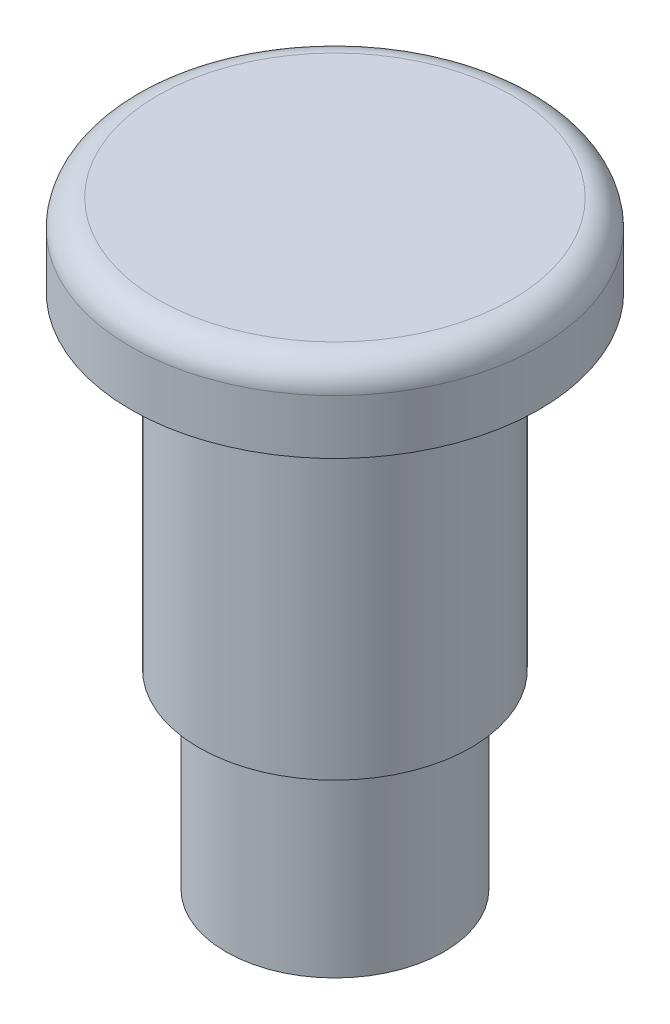
ISO-10303-21;
HEADER;
FILE_DESCRIPTION(('STEP AP214'),'2;1');
FILE_NAME('part.step','',(''),(''),'','','');
FILE_SCHEMA(('AUTOMOTIVE_DESIGN { 1 0 10303 214 1 1 1 1 }'));
ENDSEC;
DATA;
#1=APPLICATION_CONTEXT('core data for automotive mechanical design processes');
#2=APPLICATION_PROTOCOL_DEFINITION('international standard','automotive_design',2000,#1);
#3=PRODUCT_CONTEXT('',#1,'mechanical');
#4=PRODUCT('Part','Part','',(#3));
#5=PRODUCT_RELATED_PRODUCT_CATEGORY('part','',(#4));
#6=PRODUCT_DEFINITION_FORMATION('','',#4);
#7=PRODUCT_DEFINITION_CONTEXT('part definition',#1,'design');
#8=PRODUCT_DEFINITION('design','',#6,#7);
#9=PRODUCT_DEFINITION_SHAPE('','',#8);
#10=(LENGTH_UNIT() NAMED_UNIT(*) SI_UNIT(.MILLI.,.METRE.));
#11=(NAMED_UNIT(*) PLANE_ANGLE_UNIT() SI_UNIT($,.RADIAN.));
#12=(NAMED_UNIT(*) SI_UNIT($,.STERADIAN.) SOLID_ANGLE_UNIT());
#13=UNCERTAINTY_MEASURE_WITH_UNIT(LENGTH_MEASURE(1.E-05),#10,'distance_accuracy_value','');
#14=(GEOMETRIC_REPRESENTATION_CONTEXT(3) GLOBAL_UNCERTAINTY_ASSIGNED_CONTEXT((#13)) GLOBAL_UNIT_ASSIGNED_CONTEXT((#10,
#11,#12)) REPRESENTATION_CONTEXT('',''));
#15=CARTESIAN_POINT('',(0.,0.,0.));
#16=DIRECTION('',(0.,0.,1.));
#17=DIRECTION('',(1.,0.,0.));
#18=AXIS2_PLACEMENT_3D('',#15,#16,#17);
#19=CARTESIAN_POINT('',(0.,0.,0.));
#20=DIRECTION('',(0.,-1.,0.));
#21=DIRECTION('',(0.,0.,-1.));
#22=AXIS2_PLACEMENT_3D('',#19,#20,#21);
#23=PLANE('',#22);
#24=CARTESIAN_POINT('',(0.,0.,0.));
#25=DIRECTION('',(0.,1.,0.));
#26=DIRECTION('',(0.,0.,1.));
#27=AXIS2_PLACEMENT_3D('',#24,#25,#26);
#28=CIRCLE('',#27,4.);
#29=CARTESIAN_POINT('',(0.,0.,4.));
#30=VERTEX_POINT('',#29);
#31=EDGE_CURVE('E10',#30,#30,#28,.T.);
#32=ORIENTED_EDGE('',*,*,#31,.F.);
#33=EDGE_LOOP('',(#32));
#34=FACE_BOUND('',#33,.T.);
#35=ADVANCED_FACE('F37',(#34),#23,.T.);
#36=CARTESIAN_POINT('',(0.,22.,0.));
#37=DIRECTION('',(0.,1.,0.));
#38=DIRECTION('',(0.,0.,1.));
#39=AXIS2_PLACEMENT_3D('',#36,#37,#38);
#40=CYLINDRICAL_SURFACE('',#39,4.);
#41=ORIENTED_EDGE('',*,*,#31,.T.);
#42=EDGE_LOOP('',(#41));
#43=FACE_BOUND('',#42,.T.);
#44=CARTESIAN_POINT('',(0.,7.,0.));
#45=DIRECTION('',(0.,1.,0.));
#46=DIRECTION('',(0.,0.,1.));
#47=AXIS2_PLACEMENT_3D('',#44,#45,#46);
#48=CIRCLE('',#47,4.);
#49=CARTESIAN_POINT('',(0.,7.,4.));
#50=VERTEX_POINT('',#49);
#51=EDGE_CURVE('E44',#50,#50,#48,.T.);
#52=ORIENTED_EDGE('',*,*,#51,.F.);
#53=EDGE_LOOP('',(#52));
#54=FACE_BOUND('',#53,.T.);
#55=ADVANCED_FACE('F89',(#43,#54),#40,.T.);
#56=CARTESIAN_POINT('',(-4.,7.,0.));
#57=DIRECTION('',(0.,-1.,0.));
#58=DIRECTION('',(0.,0.,-1.));
#59=AXIS2_PLACEMENT_3D('',#56,#57,#58);
#60=PLANE('',#59);
#61=ORIENTED_EDGE('',*,*,#51,.T.);
#62=EDGE_LOOP('',(#61));
#63=FACE_BOUND('',#62,.T.);
#64=CARTESIAN_POINT('',(0.,7.,0.));
#65=DIRECTION('',(0.,1.,0.));
#66=DIRECTION('',(0.,0.,1.));
#67=AXIS2_PLACEMENT_3D('',#64,#65,#66);
#68=CIRCLE('',#67,5.);
#69=CARTESIAN_POINT('',(0.,7.,5.));
#70=VERTEX_POINT('',#69);
#71=EDGE_CURVE('E49',#70,#70,#68,.T.);
#72=ORIENTED_EDGE('',*,*,#71,.F.);
#73=EDGE_LOOP('',(#72));
#74=FACE_BOUND('',#73,.T.);
#75=ADVANCED_FACE('F94',(#63,#74),#60,.T.);
#76=CARTESIAN_POINT('',(0.,22.,0.));
#77=DIRECTION('',(0.,1.,0.));
#78=DIRECTION('',(0.,0.,1.));
#79=AXIS2_PLACEMENT_3D('',#76,#77,#78);
#80=CYLINDRICAL_SURFACE('',#79,5.);
#81=ORIENTED_EDGE('',*,*,#71,.T.);
#82=EDGE_LOOP('',(#81));
#83=FACE_BOUND('',#82,.T.);
#84=CARTESIAN_POINT('',(0.,19.,0.));
#85=DIRECTION('',(0.,1.,0.));
#86=DIRECTION('',(0.,0.,1.));
#87=AXIS2_PLACEMENT_3D('',#84,#85,#86);
#88=CIRCLE('',#87,5.);
#89=CARTESIAN_POINT('',(0.,19.,5.));
#90=VERTEX_POINT('',#89);
#91=EDGE_CURVE('E54',#90,#90,#88,.T.);
#92=ORIENTED_EDGE('',*,*,#91,.F.);
#93=EDGE_LOOP('',(#92));
#94=FACE_BOUND('',#93,.T.);
#95=ADVANCED_FACE('F98',(#83,#94),#80,.T.);
#96=CARTESIAN_POINT('',(-5.,19.,0.));
#97=DIRECTION('',(0.,-1.,0.));
#98=DIRECTION('',(0.,0.,-1.));
#99=AXIS2_PLACEMENT_3D('',#96,#97,#98);
#100=PLANE('',#99);
#101=ORIENTED_EDGE('',*,*,#91,.T.);
#102=EDGE_LOOP('',(#101));
#103=FACE_BOUND('',#102,.T.);
#104=CARTESIAN_POINT('',(0.,19.,0.));
#105=DIRECTION('',(0.,1.,0.));
#106=DIRECTION('',(0.,0.,1.));
#107=AXIS2_PLACEMENT_3D('',#104,#105,#106);
#108=CIRCLE('',#107,7.5);
#109=CARTESIAN_POINT('',(0.,19.,7.5));
#110=VERTEX_POINT('',#109);
#111=EDGE_CURVE('E60',#110,#110,#108,.T.);
#112=ORIENTED_EDGE('',*,*,#111,.F.);
#113=EDGE_LOOP('',(#112));
#114=FACE_BOUND('',#113,.T.);
#115=ADVANCED_FACE('F85',(#103,#114),#100,.T.);
#116=CARTESIAN_POINT('',(0.,22.,0.));
#117=DIRECTION('',(0.,1.,0.));
#118=DIRECTION('',(0.,0.,1.));
#119=AXIS2_PLACEMENT_3D('',#116,#117,#118);
#120=CYLINDRICAL_SURFACE('',#119,7.5);
#121=ORIENTED_EDGE('',*,*,#111,.T.);
#122=EDGE_LOOP('',(#121));
#123=FACE_BOUND('',#122,.T.);
#124=CARTESIAN_POINT('',(0.,21.,0.));
#125=DIRECTION('',(0.,1.,0.));
#126=DIRECTION('',(0.,0.,1.));
#127=AXIS2_PLACEMENT_3D('',#124,#125,#126);
#128=CIRCLE('',#127,7.5);
#129=CARTESIAN_POINT('',(0.,21.,7.5));
#130=VERTEX_POINT('',#129);
#131=EDGE_CURVE('E64',#130,#130,#128,.T.);
#132=ORIENTED_EDGE('',*,*,#131,.F.);
#133=EDGE_LOOP('',(#132));
#134=FACE_BOUND('',#133,.T.);
#135=ADVANCED_FACE('F77',(#123,#134),#120,.T.);
#136=CARTESIAN_POINT('',(0.,21.,0.));
#137=DIRECTION('',(0.,1.,0.));
#138=DIRECTION('',(0.,0.,1.));
#139=AXIS2_PLACEMENT_3D('',#136,#137,#138);
#140=TOROIDAL_SURFACE('',#139,6.5,1.);
#141=ORIENTED_EDGE('',*,*,#131,.T.);
#142=EDGE_LOOP('',(#141));
#143=FACE_BOUND('',#142,.T.);
#144=CARTESIAN_POINT('',(0.,22.,0.));
#145=DIRECTION('',(0.,1.,0.));
#146=DIRECTION('',(0.,0.,1.));
#147=AXIS2_PLACEMENT_3D('',#144,#145,#146);
#148=CIRCLE('',#147,6.49999999999999);
#149=CARTESIAN_POINT('',(0.,22.,6.49999999999999));
#150=VERTEX_POINT('',#149);
#151=EDGE_CURVE('E68',#150,#150,#148,.T.);
#152=ORIENTED_EDGE('',*,*,#151,.F.);
#153=EDGE_LOOP('',(#152));
#154=FACE_BOUND('',#153,.T.);
#155=ADVANCED_FACE('F75',(#143,#154),#140,.T.);
#156=CARTESIAN_POINT('',(-6.49999999999999,22.,0.));
#157=DIRECTION('',(0.,1.,0.));
#158=DIRECTION('',(0.,0.,1.));
#159=AXIS2_PLACEMENT_3D('',#156,#157,#158);
#160=PLANE('',#159);
#161=ORIENTED_EDGE('',*,*,#151,.T.);
#162=EDGE_LOOP('',(#161));
#163=FACE_BOUND('',#162,.T.);
#164=ADVANCED_FACE('F73',(#163),#160,.T.);
#165=CLOSED_SHELL('',(#35,#55,#75,#95,#115,#135,#155,#164));
#166=MANIFOLD_SOLID_BREP('B2',#165);
#167=ADVANCED_BREP_SHAPE_REPRESENTATION('',(#18,#166),#14);
#168=SHAPE_DEFINITION_REPRESENTATION(#9,#167);
ENDSEC;
END-ISO-10303-21;
